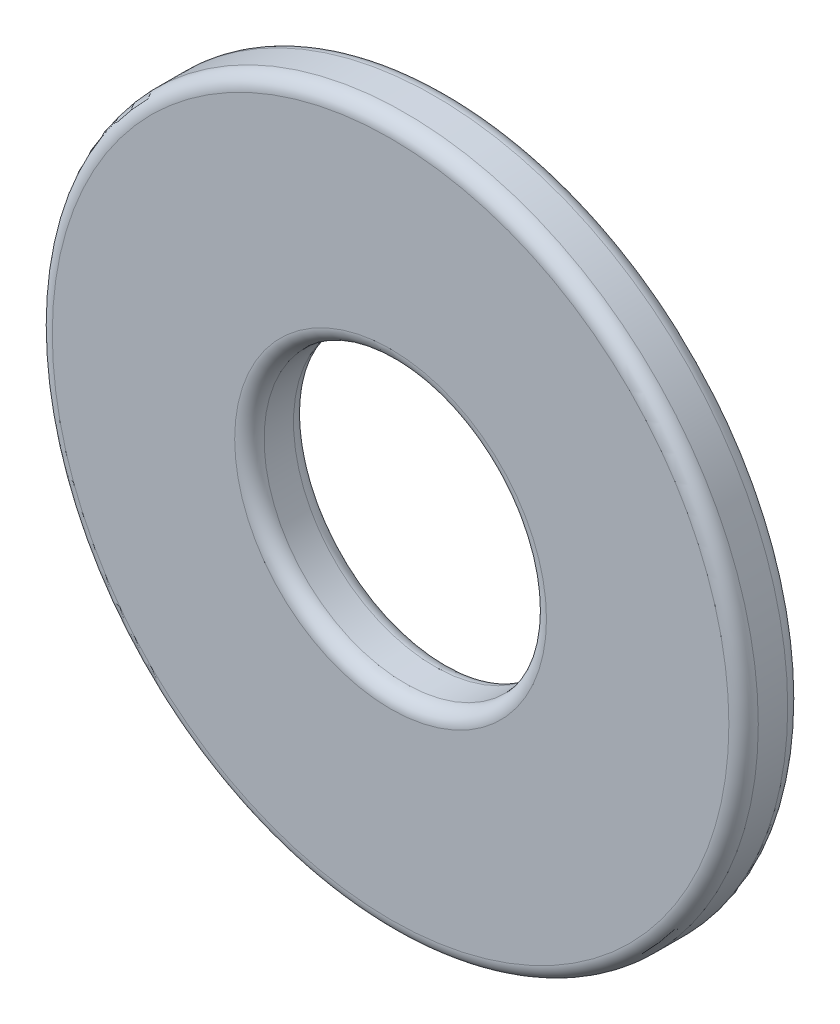
ISO-10303-21;
HEADER;
FILE_DESCRIPTION(('STEP AP214'),'2;1');
FILE_NAME('part.step','',(''),(''),'','','');
FILE_SCHEMA(('AUTOMOTIVE_DESIGN { 1 0 10303 214 1 1 1 1 }'));
ENDSEC;
DATA;
#1=APPLICATION_CONTEXT('core data for automotive mechanical design processes');
#2=APPLICATION_PROTOCOL_DEFINITION('international standard','automotive_design',2000,#1);
#3=PRODUCT_CONTEXT('',#1,'mechanical');
#4=PRODUCT('Part','Part','',(#3));
#5=PRODUCT_RELATED_PRODUCT_CATEGORY('part','',(#4));
#6=PRODUCT_DEFINITION_FORMATION('','',#4);
#7=PRODUCT_DEFINITION_CONTEXT('part definition',#1,'design');
#8=PRODUCT_DEFINITION('design','',#6,#7);
#9=PRODUCT_DEFINITION_SHAPE('','',#8);
#10=(LENGTH_UNIT() NAMED_UNIT(*) SI_UNIT(.MILLI.,.METRE.));
#11=(NAMED_UNIT(*) PLANE_ANGLE_UNIT() SI_UNIT($,.RADIAN.));
#12=(NAMED_UNIT(*) SI_UNIT($,.STERADIAN.) SOLID_ANGLE_UNIT());
#13=UNCERTAINTY_MEASURE_WITH_UNIT(LENGTH_MEASURE(1.E-05),#10,'distance_accuracy_value','');
#14=(GEOMETRIC_REPRESENTATION_CONTEXT(3) GLOBAL_UNCERTAINTY_ASSIGNED_CONTEXT((#13)) GLOBAL_UNIT_ASSIGNED_CONTEXT((#10,
#11,#12)) REPRESENTATION_CONTEXT('',''));
#15=CARTESIAN_POINT('',(0.,0.,0.));
#16=DIRECTION('',(0.,0.,1.));
#17=DIRECTION('',(1.,0.,0.));
#18=AXIS2_PLACEMENT_3D('',#15,#16,#17);
#19=CARTESIAN_POINT('',(0.,0.,1.5875));
#20=DIRECTION('',(0.,0.,1.));
#21=DIRECTION('',(1.,0.,0.));
#22=AXIS2_PLACEMENT_3D('',#19,#20,#21);
#23=PLANE('',#22);
#24=CARTESIAN_POINT('',(0.,0.,1.5875));
#25=DIRECTION('',(0.,0.,1.));
#26=DIRECTION('',(1.,0.,0.));
#27=AXIS2_PLACEMENT_3D('',#24,#25,#26);
#28=CIRCLE('',#27,4.206875);
#29=CARTESIAN_POINT('',(4.206875,0.,1.5875));
#30=VERTEX_POINT('',#29);
#31=EDGE_CURVE('E10',#30,#30,#28,.F.);
#32=ORIENTED_EDGE('',*,*,#31,.T.);
#33=EDGE_LOOP('',(#32));
#34=FACE_BOUND('',#33,.T.);
#35=CARTESIAN_POINT('',(0.,0.,1.5875));
#36=DIRECTION('',(0.,0.,1.));
#37=DIRECTION('',(1.,0.,0.));
#38=AXIS2_PLACEMENT_3D('',#35,#36,#37);
#39=CIRCLE('',#38,9.128125);
#40=CARTESIAN_POINT('',(9.128125,0.,1.5875));
#41=VERTEX_POINT('',#40);
#42=EDGE_CURVE('E45',#41,#41,#39,.T.);
#43=ORIENTED_EDGE('',*,*,#42,.T.);
#44=EDGE_LOOP('',(#43));
#45=FACE_BOUND('',#44,.T.);
#46=ADVANCED_FACE('F37',(#34,#45),#23,.T.);
#47=CARTESIAN_POINT('',(0.,0.,0.));
#48=DIRECTION('',(0.,0.,1.));
#49=DIRECTION('',(1.,0.,0.));
#50=AXIS2_PLACEMENT_3D('',#47,#48,#49);
#51=PLANE('',#50);
#52=CARTESIAN_POINT('',(0.,0.,0.));
#53=DIRECTION('',(0.,0.,1.));
#54=DIRECTION('',(1.,0.,0.));
#55=AXIS2_PLACEMENT_3D('',#52,#53,#54);
#56=CIRCLE('',#55,4.206875);
#57=CARTESIAN_POINT('',(4.206875,0.,0.));
#58=VERTEX_POINT('',#57);
#59=EDGE_CURVE('E69',#58,#58,#56,.T.);
#60=ORIENTED_EDGE('',*,*,#59,.T.);
#61=EDGE_LOOP('',(#60));
#62=FACE_BOUND('',#61,.T.);
#63=CARTESIAN_POINT('',(0.,0.,0.));
#64=DIRECTION('',(0.,0.,1.));
#65=DIRECTION('',(1.,0.,0.));
#66=AXIS2_PLACEMENT_3D('',#63,#64,#65);
#67=CIRCLE('',#66,9.128125);
#68=CARTESIAN_POINT('',(9.128125,0.,0.));
#69=VERTEX_POINT('',#68);
#70=EDGE_CURVE('E73',#69,#69,#67,.F.);
#71=ORIENTED_EDGE('',*,*,#70,.T.);
#72=EDGE_LOOP('',(#71));
#73=FACE_BOUND('',#72,.T.);
#74=ADVANCED_FACE('F78',(#62,#73),#51,.F.);
#75=CARTESIAN_POINT('',(0.,0.,1.5875));
#76=DIRECTION('',(0.,0.,-1.));
#77=DIRECTION('',(-1.,0.,0.));
#78=AXIS2_PLACEMENT_3D('',#75,#76,#77);
#79=CYLINDRICAL_SURFACE('',#78,9.525);
#80=CARTESIAN_POINT('',(0.,0.,0.396875));
#81=DIRECTION('',(0.,0.,1.));
#82=DIRECTION('',(1.,0.,0.));
#83=AXIS2_PLACEMENT_3D('',#80,#81,#82);
#84=CIRCLE('',#83,9.525);
#85=CARTESIAN_POINT('',(9.525,0.,0.396875));
#86=VERTEX_POINT('',#85);
#87=EDGE_CURVE('E50',#86,#86,#84,.T.);
#88=ORIENTED_EDGE('',*,*,#87,.T.);
#89=EDGE_LOOP('',(#88));
#90=FACE_BOUND('',#89,.T.);
#91=CARTESIAN_POINT('',(0.,0.,1.190625));
#92=DIRECTION('',(0.,0.,1.));
#93=DIRECTION('',(1.,0.,0.));
#94=AXIS2_PLACEMENT_3D('',#91,#92,#93);
#95=CIRCLE('',#94,9.525);
#96=CARTESIAN_POINT('',(9.525,0.,1.190625));
#97=VERTEX_POINT('',#96);
#98=EDGE_CURVE('E55',#97,#97,#95,.F.);
#99=ORIENTED_EDGE('',*,*,#98,.T.);
#100=EDGE_LOOP('',(#99));
#101=FACE_BOUND('',#100,.T.);
#102=ADVANCED_FACE('F88',(#90,#101),#79,.T.);
#103=CARTESIAN_POINT('',(0.,0.,1.5875));
#104=DIRECTION('',(0.,0.,-1.));
#105=DIRECTION('',(-1.,0.,0.));
#106=AXIS2_PLACEMENT_3D('',#103,#104,#105);
#107=CYLINDRICAL_SURFACE('',#106,3.81);
#108=CARTESIAN_POINT('',(0.,0.,0.396875));
#109=DIRECTION('',(0.,0.,1.));
#110=DIRECTION('',(1.,0.,0.));
#111=AXIS2_PLACEMENT_3D('',#108,#109,#110);
#112=CIRCLE('',#111,3.81);
#113=CARTESIAN_POINT('',(3.81,0.,0.396875));
#114=VERTEX_POINT('',#113);
#115=EDGE_CURVE('E61',#114,#114,#112,.F.);
#116=ORIENTED_EDGE('',*,*,#115,.T.);
#117=EDGE_LOOP('',(#116));
#118=FACE_BOUND('',#117,.T.);
#119=CARTESIAN_POINT('',(0.,0.,1.190625));
#120=DIRECTION('',(0.,0.,1.));
#121=DIRECTION('',(1.,0.,0.));
#122=AXIS2_PLACEMENT_3D('',#119,#120,#121);
#123=CIRCLE('',#122,3.81);
#124=CARTESIAN_POINT('',(3.81,0.,1.190625));
#125=VERTEX_POINT('',#124);
#126=EDGE_CURVE('E65',#125,#125,#123,.T.);
#127=ORIENTED_EDGE('',*,*,#126,.T.);
#128=EDGE_LOOP('',(#127));
#129=FACE_BOUND('',#128,.T.);
#130=ADVANCED_FACE('F91',(#118,#129),#107,.F.);
#131=CARTESIAN_POINT('',(0.,0.,0.396875));
#132=DIRECTION('',(0.,0.,1.));
#133=DIRECTION('',(1.,0.,0.));
#134=AXIS2_PLACEMENT_3D('',#131,#132,#133);
#135=TOROIDAL_SURFACE('',#134,4.206875,0.396875);
#136=ORIENTED_EDGE('',*,*,#115,.F.);
#137=EDGE_LOOP('',(#136));
#138=FACE_BOUND('',#137,.T.);
#139=ORIENTED_EDGE('',*,*,#59,.F.);
#140=EDGE_LOOP('',(#139));
#141=FACE_BOUND('',#140,.T.);
#142=ADVANCED_FACE('F84',(#138,#141),#135,.T.);
#143=CARTESIAN_POINT('',(0.,0.,0.396875));
#144=DIRECTION('',(0.,0.,1.));
#145=DIRECTION('',(1.,0.,0.));
#146=AXIS2_PLACEMENT_3D('',#143,#144,#145);
#147=TOROIDAL_SURFACE('',#146,9.128125,0.396875);
#148=ORIENTED_EDGE('',*,*,#70,.F.);
#149=EDGE_LOOP('',(#148));
#150=FACE_BOUND('',#149,.T.);
#151=ORIENTED_EDGE('',*,*,#87,.F.);
#152=EDGE_LOOP('',(#151));
#153=FACE_BOUND('',#152,.T.);
#154=ADVANCED_FACE('F80',(#150,#153),#147,.T.);
#155=CARTESIAN_POINT('',(0.,0.,1.190625));
#156=DIRECTION('',(0.,0.,1.));
#157=DIRECTION('',(1.,0.,0.));
#158=AXIS2_PLACEMENT_3D('',#155,#156,#157);
#159=TOROIDAL_SURFACE('',#158,4.206875,0.396875);
#160=ORIENTED_EDGE('',*,*,#31,.F.);
#161=EDGE_LOOP('',(#160));
#162=FACE_BOUND('',#161,.T.);
#163=ORIENTED_EDGE('',*,*,#126,.F.);
#164=EDGE_LOOP('',(#163));
#165=FACE_BOUND('',#164,.T.);
#166=ADVANCED_FACE('F83',(#162,#165),#159,.T.);
#167=CARTESIAN_POINT('',(0.,0.,1.190625));
#168=DIRECTION('',(0.,0.,1.));
#169=DIRECTION('',(1.,0.,0.));
#170=AXIS2_PLACEMENT_3D('',#167,#168,#169);
#171=TOROIDAL_SURFACE('',#170,9.128125,0.396875);
#172=ORIENTED_EDGE('',*,*,#98,.F.);
#173=EDGE_LOOP('',(#172));
#174=FACE_BOUND('',#173,.T.);
#175=ORIENTED_EDGE('',*,*,#42,.F.);
#176=EDGE_LOOP('',(#175));
#177=FACE_BOUND('',#176,.T.);
#178=ADVANCED_FACE('F39',(#174,#177),#171,.T.);
#179=CLOSED_SHELL('',(#46,#74,#102,#130,#142,#154,#166,#178));
#180=MANIFOLD_SOLID_BREP('B2',#179);
#181=ADVANCED_BREP_SHAPE_REPRESENTATION('',(#18,#180),#14);
#182=SHAPE_DEFINITION_REPRESENTATION(#9,#181);
ENDSEC;
END-ISO-10303-21;
